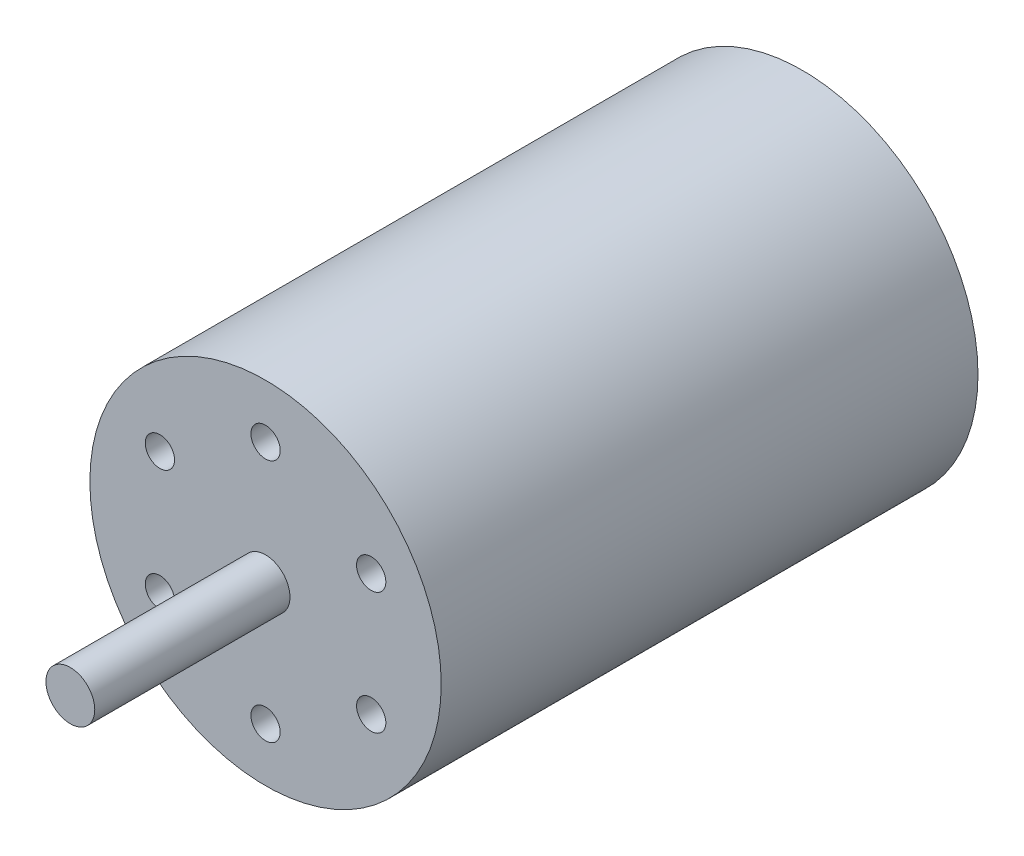
ISO-10303-21;
HEADER;
FILE_DESCRIPTION(('STEP AP214'),'2;1');
FILE_NAME('part.step','',(''),(''),'','','');
FILE_SCHEMA(('AUTOMOTIVE_DESIGN { 1 0 10303 214 1 1 1 1 }'));
ENDSEC;
DATA;
#1=APPLICATION_CONTEXT('core data for automotive mechanical design processes');
#2=APPLICATION_PROTOCOL_DEFINITION('international standard','automotive_design',2000,#1);
#3=PRODUCT_CONTEXT('',#1,'mechanical');
#4=PRODUCT('Part','Part','',(#3));
#5=PRODUCT_RELATED_PRODUCT_CATEGORY('part','',(#4));
#6=PRODUCT_DEFINITION_FORMATION('','',#4);
#7=PRODUCT_DEFINITION_CONTEXT('part definition',#1,'design');
#8=PRODUCT_DEFINITION('design','',#6,#7);
#9=PRODUCT_DEFINITION_SHAPE('','',#8);
#10=(LENGTH_UNIT() NAMED_UNIT(*) SI_UNIT(.MILLI.,.METRE.));
#11=(NAMED_UNIT(*) PLANE_ANGLE_UNIT() SI_UNIT($,.RADIAN.));
#12=(NAMED_UNIT(*) SI_UNIT($,.STERADIAN.) SOLID_ANGLE_UNIT());
#13=UNCERTAINTY_MEASURE_WITH_UNIT(LENGTH_MEASURE(1.E-05),#10,'distance_accuracy_value','');
#14=(GEOMETRIC_REPRESENTATION_CONTEXT(3) GLOBAL_UNCERTAINTY_ASSIGNED_CONTEXT((#13)) GLOBAL_UNIT_ASSIGNED_CONTEXT((#10,
#11,#12)) REPRESENTATION_CONTEXT('',''));
#15=CARTESIAN_POINT('',(0.,0.,0.));
#16=DIRECTION('',(0.,0.,1.));
#17=DIRECTION('',(1.,0.,0.));
#18=AXIS2_PLACEMENT_3D('',#15,#16,#17);
#19=CARTESIAN_POINT('',(0.,0.,55.));
#20=DIRECTION('',(0.,0.,-1.));
#21=DIRECTION('',(-1.,0.,0.));
#22=AXIS2_PLACEMENT_3D('',#19,#20,#21);
#23=CYLINDRICAL_SURFACE('',#22,18.);
#24=CARTESIAN_POINT('',(0.,0.,55.));
#25=DIRECTION('',(0.,0.,1.));
#26=DIRECTION('',(1.,0.,0.));
#27=AXIS2_PLACEMENT_3D('',#24,#25,#26);
#28=CIRCLE('',#27,18.);
#29=CARTESIAN_POINT('',(18.,0.,55.));
#30=VERTEX_POINT('',#29);
#31=EDGE_CURVE('E12',#30,#30,#28,.T.);
#32=ORIENTED_EDGE('',*,*,#31,.F.);
#33=EDGE_LOOP('',(#32));
#34=FACE_BOUND('',#33,.T.);
#35=CARTESIAN_POINT('',(0.,0.,0.));
#36=DIRECTION('',(0.,0.,1.));
#37=DIRECTION('',(1.,0.,0.));
#38=AXIS2_PLACEMENT_3D('',#35,#36,#37);
#39=CIRCLE('',#38,18.);
#40=CARTESIAN_POINT('',(18.,0.,0.));
#41=VERTEX_POINT('',#40);
#42=EDGE_CURVE('E46',#41,#41,#39,.T.);
#43=ORIENTED_EDGE('',*,*,#42,.T.);
#44=EDGE_LOOP('',(#43));
#45=FACE_BOUND('',#44,.T.);
#46=ADVANCED_FACE('F43',(#34,#45),#23,.T.);
#47=CARTESIAN_POINT('',(0.,0.,55.));
#48=DIRECTION('',(0.,0.,1.));
#49=DIRECTION('',(1.,0.,0.));
#50=AXIS2_PLACEMENT_3D('',#47,#48,#49);
#51=PLANE('',#50);
#52=CARTESIAN_POINT('',(10.8253175473058,6.25000000000062,55.));
#53=DIRECTION('',(0.,0.,1.));
#54=DIRECTION('',(1.,0.,0.));
#55=AXIS2_PLACEMENT_3D('',#52,#53,#54);
#56=CIRCLE('',#55,1.50000000000019);
#57=CARTESIAN_POINT('',(12.325317547306,6.25000000000062,55.));
#58=VERTEX_POINT('',#57);
#59=EDGE_CURVE('E91',#58,#58,#56,.T.);
#60=ORIENTED_EDGE('',*,*,#59,.F.);
#61=EDGE_LOOP('',(#60));
#62=FACE_BOUND('',#61,.T.);
#63=CARTESIAN_POINT('',(10.8253175473065,-6.24999999999939,55.));
#64=DIRECTION('',(0.,0.,1.));
#65=DIRECTION('',(1.,0.,0.));
#66=AXIS2_PLACEMENT_3D('',#63,#64,#65);
#67=CIRCLE('',#66,1.5000000000009);
#68=CARTESIAN_POINT('',(12.3253175473074,-6.24999999999939,55.));
#69=VERTEX_POINT('',#68);
#70=EDGE_CURVE('E85',#69,#69,#67,.T.);
#71=ORIENTED_EDGE('',*,*,#70,.F.);
#72=EDGE_LOOP('',(#71));
#73=FACE_BOUND('',#72,.T.);
#74=CARTESIAN_POINT('',(1.41802385452233E-12,-12.5,55.));
#75=DIRECTION('',(0.,0.,1.));
#76=DIRECTION('',(1.,0.,0.));
#77=AXIS2_PLACEMENT_3D('',#74,#75,#76);
#78=CIRCLE('',#77,1.50000000000144);
#79=CARTESIAN_POINT('',(1.50000000000286,-12.5,55.));
#80=VERTEX_POINT('',#79);
#81=EDGE_CURVE('E79',#80,#80,#78,.T.);
#82=ORIENTED_EDGE('',*,*,#81,.F.);
#83=EDGE_LOOP('',(#82));
#84=FACE_BOUND('',#83,.T.);
#85=CARTESIAN_POINT('',(-10.8253175473044,-6.25000000000062,55.));
#86=DIRECTION('',(0.,0.,1.));
#87=DIRECTION('',(1.,0.,0.));
#88=AXIS2_PLACEMENT_3D('',#85,#86,#87);
#89=CIRCLE('',#88,1.50000000000131);
#90=CARTESIAN_POINT('',(-9.32531754730311,-6.25000000000062,55.));
#91=VERTEX_POINT('',#90);
#92=EDGE_CURVE('E73',#91,#91,#89,.T.);
#93=ORIENTED_EDGE('',*,*,#92,.F.);
#94=EDGE_LOOP('',(#93));
#95=FACE_BOUND('',#94,.T.);
#96=CARTESIAN_POINT('',(-10.8253175473051,6.24999999999938,55.));
#97=DIRECTION('',(0.,0.,1.));
#98=DIRECTION('',(1.,0.,0.));
#99=AXIS2_PLACEMENT_3D('',#96,#97,#98);
#100=CIRCLE('',#99,1.50000000000067);
#101=CARTESIAN_POINT('',(-9.32531754730447,6.24999999999938,55.));
#102=VERTEX_POINT('',#101);
#103=EDGE_CURVE('E67',#102,#102,#100,.T.);
#104=ORIENTED_EDGE('',*,*,#103,.F.);
#105=EDGE_LOOP('',(#104));
#106=FACE_BOUND('',#105,.T.);
#107=CARTESIAN_POINT('',(0.,12.5,55.));
#108=DIRECTION('',(0.,0.,1.));
#109=DIRECTION('',(1.,0.,0.));
#110=AXIS2_PLACEMENT_3D('',#107,#108,#109);
#111=CIRCLE('',#110,1.5);
#112=CARTESIAN_POINT('',(1.5,12.5,55.));
#113=VERTEX_POINT('',#112);
#114=EDGE_CURVE('E61',#113,#113,#111,.T.);
#115=ORIENTED_EDGE('',*,*,#114,.F.);
#116=EDGE_LOOP('',(#115));
#117=FACE_BOUND('',#116,.T.);
#118=CARTESIAN_POINT('',(0.,0.,55.));
#119=DIRECTION('',(0.,0.,1.));
#120=DIRECTION('',(1.,0.,0.));
#121=AXIS2_PLACEMENT_3D('',#118,#119,#120);
#122=CIRCLE('',#121,2.5);
#123=CARTESIAN_POINT('',(2.5,0.,55.));
#124=VERTEX_POINT('',#123);
#125=EDGE_CURVE('E55',#124,#124,#122,.T.);
#126=ORIENTED_EDGE('',*,*,#125,.F.);
#127=EDGE_LOOP('',(#126));
#128=FACE_BOUND('',#127,.T.);
#129=ORIENTED_EDGE('',*,*,#31,.T.);
#130=EDGE_LOOP('',(#129));
#131=FACE_BOUND('',#130,.T.);
#132=ADVANCED_FACE('F106',(#62,#73,#84,#95,#106,#117,#128,#131),#51,.T.);
#133=CARTESIAN_POINT('',(0.,0.,0.));
#134=DIRECTION('',(0.,0.,1.));
#135=DIRECTION('',(1.,0.,0.));
#136=AXIS2_PLACEMENT_3D('',#133,#134,#135);
#137=PLANE('',#136);
#138=ORIENTED_EDGE('',*,*,#42,.F.);
#139=EDGE_LOOP('',(#138));
#140=FACE_BOUND('',#139,.T.);
#141=ADVANCED_FACE('F109',(#140),#137,.F.);
#142=CARTESIAN_POINT('',(0.,0.,75.));
#143=DIRECTION('',(0.,0.,-1.));
#144=DIRECTION('',(-1.,0.,0.));
#145=AXIS2_PLACEMENT_3D('',#142,#143,#144);
#146=CYLINDRICAL_SURFACE('',#145,2.5);
#147=CARTESIAN_POINT('',(0.,0.,75.));
#148=DIRECTION('',(0.,0.,1.));
#149=DIRECTION('',(1.,0.,0.));
#150=AXIS2_PLACEMENT_3D('',#147,#148,#149);
#151=CIRCLE('',#150,2.5);
#152=CARTESIAN_POINT('',(2.5,0.,75.));
#153=VERTEX_POINT('',#152);
#154=EDGE_CURVE('E53',#153,#153,#151,.T.);
#155=ORIENTED_EDGE('',*,*,#154,.F.);
#156=EDGE_LOOP('',(#155));
#157=FACE_BOUND('',#156,.T.);
#158=ORIENTED_EDGE('',*,*,#125,.T.);
#159=EDGE_LOOP('',(#158));
#160=FACE_BOUND('',#159,.T.);
#161=ADVANCED_FACE('F123',(#157,#160),#146,.T.);
#162=CARTESIAN_POINT('',(0.,0.,75.));
#163=DIRECTION('',(0.,0.,1.));
#164=DIRECTION('',(1.,0.,0.));
#165=AXIS2_PLACEMENT_3D('',#162,#163,#164);
#166=PLANE('',#165);
#167=ORIENTED_EDGE('',*,*,#154,.T.);
#168=EDGE_LOOP('',(#167));
#169=FACE_BOUND('',#168,.T.);
#170=ADVANCED_FACE('F125',(#169),#166,.T.);
#171=CARTESIAN_POINT('',(0.,12.5,45.));
#172=DIRECTION('',(0.,0.,1.));
#173=DIRECTION('',(1.,0.,0.));
#174=AXIS2_PLACEMENT_3D('',#171,#172,#173);
#175=CYLINDRICAL_SURFACE('',#174,1.5);
#176=CARTESIAN_POINT('',(0.,12.5,45.));
#177=DIRECTION('',(0.,0.,1.));
#178=DIRECTION('',(1.,0.,0.));
#179=AXIS2_PLACEMENT_3D('',#176,#177,#178);
#180=CIRCLE('',#179,1.5);
#181=CARTESIAN_POINT('',(1.5,12.5,45.));
#182=VERTEX_POINT('',#181);
#183=EDGE_CURVE('E58',#182,#182,#180,.T.);
#184=ORIENTED_EDGE('',*,*,#183,.F.);
#185=EDGE_LOOP('',(#184));
#186=FACE_BOUND('',#185,.T.);
#187=ORIENTED_EDGE('',*,*,#114,.T.);
#188=EDGE_LOOP('',(#187));
#189=FACE_BOUND('',#188,.T.);
#190=ADVANCED_FACE('F132',(#186,#189),#175,.F.);
#191=CARTESIAN_POINT('',(0.,12.5,45.));
#192=DIRECTION('',(0.,0.,1.));
#193=DIRECTION('',(1.,0.,0.));
#194=AXIS2_PLACEMENT_3D('',#191,#192,#193);
#195=PLANE('',#194);
#196=ORIENTED_EDGE('',*,*,#183,.T.);
#197=EDGE_LOOP('',(#196));
#198=FACE_BOUND('',#197,.T.);
#199=ADVANCED_FACE('F170',(#198),#195,.T.);
#200=CARTESIAN_POINT('',(-10.8253175473051,6.24999999999938,45.));
#201=DIRECTION('',(0.,0.,1.));
#202=DIRECTION('',(1.,0.,0.));
#203=AXIS2_PLACEMENT_3D('',#200,#201,#202);
#204=CYLINDRICAL_SURFACE('',#203,1.50000000000067);
#205=CARTESIAN_POINT('',(-10.8253175473051,6.24999999999938,45.));
#206=DIRECTION('',(0.,0.,1.));
#207=DIRECTION('',(1.,0.,0.));
#208=AXIS2_PLACEMENT_3D('',#205,#206,#207);
#209=CIRCLE('',#208,1.50000000000067);
#210=CARTESIAN_POINT('',(-9.32531754730447,6.24999999999938,45.));
#211=VERTEX_POINT('',#210);
#212=EDGE_CURVE('E70',#211,#211,#209,.T.);
#213=ORIENTED_EDGE('',*,*,#212,.F.);
#214=EDGE_LOOP('',(#213));
#215=FACE_BOUND('',#214,.T.);
#216=ORIENTED_EDGE('',*,*,#103,.T.);
#217=EDGE_LOOP('',(#216));
#218=FACE_BOUND('',#217,.T.);
#219=ADVANCED_FACE('F177',(#215,#218),#204,.F.);
#220=CARTESIAN_POINT('',(-10.8253175473051,6.24999999999938,45.));
#221=DIRECTION('',(0.,0.,1.));
#222=DIRECTION('',(1.,0.,0.));
#223=AXIS2_PLACEMENT_3D('',#220,#221,#222);
#224=PLANE('',#223);
#225=ORIENTED_EDGE('',*,*,#212,.T.);
#226=EDGE_LOOP('',(#225));
#227=FACE_BOUND('',#226,.T.);
#228=ADVANCED_FACE('F185',(#227),#224,.T.);
#229=CARTESIAN_POINT('',(-10.8253175473044,-6.25000000000062,45.));
#230=DIRECTION('',(0.,0.,1.));
#231=DIRECTION('',(1.,0.,0.));
#232=AXIS2_PLACEMENT_3D('',#229,#230,#231);
#233=CYLINDRICAL_SURFACE('',#232,1.50000000000131);
#234=CARTESIAN_POINT('',(-10.8253175473044,-6.25000000000062,45.));
#235=DIRECTION('',(0.,0.,1.));
#236=DIRECTION('',(1.,0.,0.));
#237=AXIS2_PLACEMENT_3D('',#234,#235,#236);
#238=CIRCLE('',#237,1.50000000000131);
#239=CARTESIAN_POINT('',(-9.32531754730311,-6.25000000000062,45.));
#240=VERTEX_POINT('',#239);
#241=EDGE_CURVE('E76',#240,#240,#238,.T.);
#242=ORIENTED_EDGE('',*,*,#241,.F.);
#243=EDGE_LOOP('',(#242));
#244=FACE_BOUND('',#243,.T.);
#245=ORIENTED_EDGE('',*,*,#92,.T.);
#246=EDGE_LOOP('',(#245));
#247=FACE_BOUND('',#246,.T.);
#248=ADVANCED_FACE('F193',(#244,#247),#233,.F.);
#249=CARTESIAN_POINT('',(-10.8253175473044,-6.25000000000062,45.));
#250=DIRECTION('',(0.,0.,1.));
#251=DIRECTION('',(1.,0.,0.));
#252=AXIS2_PLACEMENT_3D('',#249,#250,#251);
#253=PLANE('',#252);
#254=ORIENTED_EDGE('',*,*,#241,.T.);
#255=EDGE_LOOP('',(#254));
#256=FACE_BOUND('',#255,.T.);
#257=ADVANCED_FACE('F201',(#256),#253,.T.);
#258=CARTESIAN_POINT('',(1.41802385452233E-12,-12.5,45.));
#259=DIRECTION('',(0.,0.,1.));
#260=DIRECTION('',(1.,0.,0.));
#261=AXIS2_PLACEMENT_3D('',#258,#259,#260);
#262=CYLINDRICAL_SURFACE('',#261,1.50000000000144);
#263=CARTESIAN_POINT('',(1.41802385452233E-12,-12.5,45.));
#264=DIRECTION('',(0.,0.,1.));
#265=DIRECTION('',(1.,0.,0.));
#266=AXIS2_PLACEMENT_3D('',#263,#264,#265);
#267=CIRCLE('',#266,1.50000000000144);
#268=CARTESIAN_POINT('',(1.50000000000286,-12.5,45.));
#269=VERTEX_POINT('',#268);
#270=EDGE_CURVE('E82',#269,#269,#267,.T.);
#271=ORIENTED_EDGE('',*,*,#270,.F.);
#272=EDGE_LOOP('',(#271));
#273=FACE_BOUND('',#272,.T.);
#274=ORIENTED_EDGE('',*,*,#81,.T.);
#275=EDGE_LOOP('',(#274));
#276=FACE_BOUND('',#275,.T.);
#277=ADVANCED_FACE('F209',(#273,#276),#262,.F.);
#278=CARTESIAN_POINT('',(1.41802385452233E-12,-12.5,45.));
#279=DIRECTION('',(0.,0.,1.));
#280=DIRECTION('',(1.,0.,0.));
#281=AXIS2_PLACEMENT_3D('',#278,#279,#280);
#282=PLANE('',#281);
#283=ORIENTED_EDGE('',*,*,#270,.T.);
#284=EDGE_LOOP('',(#283));
#285=FACE_BOUND('',#284,.T.);
#286=ADVANCED_FACE('F217',(#285),#282,.T.);
#287=CARTESIAN_POINT('',(10.8253175473065,-6.24999999999939,45.));
#288=DIRECTION('',(0.,0.,1.));
#289=DIRECTION('',(1.,0.,0.));
#290=AXIS2_PLACEMENT_3D('',#287,#288,#289);
#291=CYLINDRICAL_SURFACE('',#290,1.5000000000009);
#292=CARTESIAN_POINT('',(10.8253175473065,-6.24999999999939,45.));
#293=DIRECTION('',(0.,0.,1.));
#294=DIRECTION('',(1.,0.,0.));
#295=AXIS2_PLACEMENT_3D('',#292,#293,#294);
#296=CIRCLE('',#295,1.5000000000009);
#297=CARTESIAN_POINT('',(12.3253175473074,-6.24999999999939,45.));
#298=VERTEX_POINT('',#297);
#299=EDGE_CURVE('E88',#298,#298,#296,.T.);
#300=ORIENTED_EDGE('',*,*,#299,.F.);
#301=EDGE_LOOP('',(#300));
#302=FACE_BOUND('',#301,.T.);
#303=ORIENTED_EDGE('',*,*,#70,.T.);
#304=EDGE_LOOP('',(#303));
#305=FACE_BOUND('',#304,.T.);
#306=ADVANCED_FACE('F225',(#302,#305),#291,.F.);
#307=CARTESIAN_POINT('',(10.8253175473065,-6.24999999999939,45.));
#308=DIRECTION('',(0.,0.,1.));
#309=DIRECTION('',(1.,0.,0.));
#310=AXIS2_PLACEMENT_3D('',#307,#308,#309);
#311=PLANE('',#310);
#312=ORIENTED_EDGE('',*,*,#299,.T.);
#313=EDGE_LOOP('',(#312));
#314=FACE_BOUND('',#313,.T.);
#315=ADVANCED_FACE('F102',(#314),#311,.T.);
#316=CARTESIAN_POINT('',(10.8253175473058,6.25000000000062,45.));
#317=DIRECTION('',(0.,0.,1.));
#318=DIRECTION('',(1.,0.,0.));
#319=AXIS2_PLACEMENT_3D('',#316,#317,#318);
#320=CYLINDRICAL_SURFACE('',#319,1.50000000000019);
#321=CARTESIAN_POINT('',(10.8253175473058,6.25000000000062,45.));
#322=DIRECTION('',(0.,0.,1.));
#323=DIRECTION('',(1.,0.,0.));
#324=AXIS2_PLACEMENT_3D('',#321,#322,#323);
#325=CIRCLE('',#324,1.50000000000019);
#326=CARTESIAN_POINT('',(12.325317547306,6.25000000000062,45.));
#327=VERTEX_POINT('',#326);
#328=EDGE_CURVE('E64',#327,#327,#325,.T.);
#329=ORIENTED_EDGE('',*,*,#328,.F.);
#330=EDGE_LOOP('',(#329));
#331=FACE_BOUND('',#330,.T.);
#332=ORIENTED_EDGE('',*,*,#59,.T.);
#333=EDGE_LOOP('',(#332));
#334=FACE_BOUND('',#333,.T.);
#335=ADVANCED_FACE('F99',(#331,#334),#320,.F.);
#336=CARTESIAN_POINT('',(10.8253175473058,6.25000000000062,45.));
#337=DIRECTION('',(0.,0.,1.));
#338=DIRECTION('',(1.,0.,0.));
#339=AXIS2_PLACEMENT_3D('',#336,#337,#338);
#340=PLANE('',#339);
#341=ORIENTED_EDGE('',*,*,#328,.T.);
#342=EDGE_LOOP('',(#341));
#343=FACE_BOUND('',#342,.T.);
#344=ADVANCED_FACE('F97',(#343),#340,.T.);
#345=CLOSED_SHELL('',(#46,#132,#141,#161,#170,#190,#199,#219,#228,#248,#257,#277,#286,#306,#315,
#335,#344));
#346=MANIFOLD_SOLID_BREP('B2',#345);
#347=ADVANCED_BREP_SHAPE_REPRESENTATION('',(#18,#346),#14);
#348=SHAPE_DEFINITION_REPRESENTATION(#9,#347);
ENDSEC;
END-ISO-10303-21;
